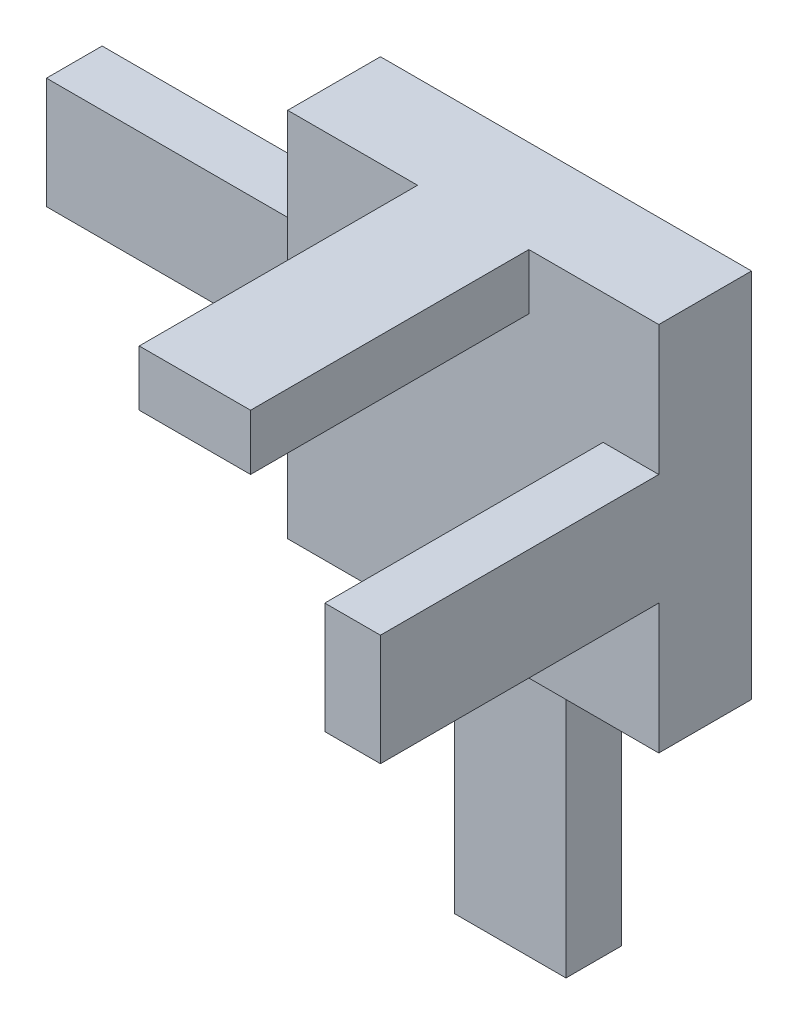
ISO-10303-21;
HEADER;
FILE_DESCRIPTION(('STEP AP214'),'2;1');
FILE_NAME('part.step','',(''),(''),'','','');
FILE_SCHEMA(('AUTOMOTIVE_DESIGN { 1 0 10303 214 1 1 1 1 }'));
ENDSEC;
DATA;
#1=APPLICATION_CONTEXT('core data for automotive mechanical design processes');
#2=APPLICATION_PROTOCOL_DEFINITION('international standard','automotive_design',2000,#1);
#3=PRODUCT_CONTEXT('',#1,'mechanical');
#4=PRODUCT('Part','Part','',(#3));
#5=PRODUCT_RELATED_PRODUCT_CATEGORY('part','',(#4));
#6=PRODUCT_DEFINITION_FORMATION('','',#4);
#7=PRODUCT_DEFINITION_CONTEXT('part definition',#1,'design');
#8=PRODUCT_DEFINITION('design','',#6,#7);
#9=PRODUCT_DEFINITION_SHAPE('','',#8);
#10=(LENGTH_UNIT() NAMED_UNIT(*) SI_UNIT(.MILLI.,.METRE.));
#11=(NAMED_UNIT(*) PLANE_ANGLE_UNIT() SI_UNIT($,.RADIAN.));
#12=(NAMED_UNIT(*) SI_UNIT($,.STERADIAN.) SOLID_ANGLE_UNIT());
#13=UNCERTAINTY_MEASURE_WITH_UNIT(LENGTH_MEASURE(1.E-05),#10,'distance_accuracy_value','');
#14=(GEOMETRIC_REPRESENTATION_CONTEXT(3) GLOBAL_UNCERTAINTY_ASSIGNED_CONTEXT((#13)) GLOBAL_UNIT_ASSIGNED_CONTEXT((#10,
#11,#12)) REPRESENTATION_CONTEXT('',''));
#15=CARTESIAN_POINT('',(0.,0.,0.));
#16=DIRECTION('',(0.,0.,1.));
#17=DIRECTION('',(1.,0.,0.));
#18=AXIS2_PLACEMENT_3D('',#15,#16,#17);
#19=CARTESIAN_POINT('',(0.,0.,5.));
#20=DIRECTION('',(1.,0.,0.));
#21=DIRECTION('',(0.,0.,-1.));
#22=AXIS2_PLACEMENT_3D('',#19,#20,#21);
#23=PLANE('',#22);
#24=DIRECTION('',(0.,0.,-1.));
#25=VECTOR('',#24,1.);
#26=CARTESIAN_POINT('',(0.,13.,0.));
#27=LINE('',#26,#25);
#28=CARTESIAN_POINT('',(0.,13.,3.));
#29=VERTEX_POINT('',#28);
#30=CARTESIAN_POINT('',(0.,13.,0.));
#31=VERTEX_POINT('',#30);
#32=EDGE_CURVE('E47',#29,#31,#27,.T.);
#33=ORIENTED_EDGE('',*,*,#32,.F.);
#34=DIRECTION('',(0.,1.,0.));
#35=VECTOR('',#34,1.);
#36=CARTESIAN_POINT('',(0.,13.,3.));
#37=LINE('',#36,#35);
#38=CARTESIAN_POINT('',(0.,7.,3.));
#39=VERTEX_POINT('',#38);
#40=EDGE_CURVE('E537',#39,#29,#37,.T.);
#41=ORIENTED_EDGE('',*,*,#40,.F.);
#42=DIRECTION('',(0.,0.,1.));
#43=VECTOR('',#42,1.);
#44=CARTESIAN_POINT('',(0.,7.,0.));
#45=LINE('',#44,#43);
#46=CARTESIAN_POINT('',(0.,7.,0.));
#47=VERTEX_POINT('',#46);
#48=EDGE_CURVE('E53',#47,#39,#45,.T.);
#49=ORIENTED_EDGE('',*,*,#48,.F.);
#50=DIRECTION('',(0.,-1.,0.));
#51=VECTOR('',#50,1.);
#52=CARTESIAN_POINT('',(0.,0.,0.));
#53=LINE('',#52,#51);
#54=CARTESIAN_POINT('',(0.,0.,0.));
#55=VERTEX_POINT('',#54);
#56=EDGE_CURVE('E191',#47,#55,#53,.T.);
#57=ORIENTED_EDGE('',*,*,#56,.T.);
#58=DIRECTION('',(0.,0.,-1.));
#59=VECTOR('',#58,1.);
#60=CARTESIAN_POINT('',(0.,0.,5.));
#61=LINE('',#60,#59);
#62=CARTESIAN_POINT('',(0.,0.,5.));
#63=VERTEX_POINT('',#62);
#64=EDGE_CURVE('E11',#63,#55,#61,.T.);
#65=ORIENTED_EDGE('',*,*,#64,.F.);
#66=DIRECTION('',(0.,-1.,0.));
#67=VECTOR('',#66,1.);
#68=CARTESIAN_POINT('',(0.,0.,5.));
#69=LINE('',#68,#67);
#70=CARTESIAN_POINT('',(0.,20.,5.));
#71=VERTEX_POINT('',#70);
#72=EDGE_CURVE('E287',#71,#63,#69,.T.);
#73=ORIENTED_EDGE('',*,*,#72,.F.);
#74=DIRECTION('',(0.,0.,-1.));
#75=VECTOR('',#74,1.);
#76=CARTESIAN_POINT('',(0.,20.,5.));
#77=LINE('',#76,#75);
#78=CARTESIAN_POINT('',(0.,20.,0.));
#79=VERTEX_POINT('',#78);
#80=EDGE_CURVE('E299',#71,#79,#77,.T.);
#81=ORIENTED_EDGE('',*,*,#80,.T.);
#82=EDGE_CURVE('E300',#79,#31,#53,.T.);
#83=ORIENTED_EDGE('',*,*,#82,.T.);
#84=EDGE_LOOP('',(#33,#41,#49,#57,#65,#73,#81,#83));
#85=FACE_BOUND('',#84,.T.);
#86=ADVANCED_FACE('F33',(#85),#23,.F.);
#87=CARTESIAN_POINT('',(0.,0.,5.));
#88=DIRECTION('',(0.,1.,0.));
#89=DIRECTION('',(0.,0.,1.));
#90=AXIS2_PLACEMENT_3D('',#87,#88,#89);
#91=PLANE('',#90);
#92=DIRECTION('',(0.,0.,-1.));
#93=VECTOR('',#92,1.);
#94=CARTESIAN_POINT('',(7.,0.,0.));
#95=LINE('',#94,#93);
#96=CARTESIAN_POINT('',(7.,0.,3.));
#97=VERTEX_POINT('',#96);
#98=CARTESIAN_POINT('',(7.,0.,0.));
#99=VERTEX_POINT('',#98);
#100=EDGE_CURVE('E192',#97,#99,#95,.T.);
#101=ORIENTED_EDGE('',*,*,#100,.F.);
#102=DIRECTION('',(-1.,0.,0.));
#103=VECTOR('',#102,1.);
#104=CARTESIAN_POINT('',(7.,0.,3.));
#105=LINE('',#104,#103);
#106=CARTESIAN_POINT('',(13.,0.,3.));
#107=VERTEX_POINT('',#106);
#108=EDGE_CURVE('E205',#107,#97,#105,.T.);
#109=ORIENTED_EDGE('',*,*,#108,.F.);
#110=DIRECTION('',(0.,0.,1.));
#111=VECTOR('',#110,1.);
#112=CARTESIAN_POINT('',(13.,0.,0.));
#113=LINE('',#112,#111);
#114=CARTESIAN_POINT('',(13.,0.,0.));
#115=VERTEX_POINT('',#114);
#116=EDGE_CURVE('E195',#115,#107,#113,.T.);
#117=ORIENTED_EDGE('',*,*,#116,.F.);
#118=DIRECTION('',(1.,0.,0.));
#119=VECTOR('',#118,1.);
#120=CARTESIAN_POINT('',(0.,0.,0.));
#121=LINE('',#120,#119);
#122=CARTESIAN_POINT('',(20.,0.,0.));
#123=VERTEX_POINT('',#122);
#124=EDGE_CURVE('E302',#115,#123,#121,.T.);
#125=ORIENTED_EDGE('',*,*,#124,.T.);
#126=DIRECTION('',(0.,0.,-1.));
#127=VECTOR('',#126,1.);
#128=CARTESIAN_POINT('',(20.,0.,5.));
#129=LINE('',#128,#127);
#130=CARTESIAN_POINT('',(20.,0.,5.));
#131=VERTEX_POINT('',#130);
#132=EDGE_CURVE('E40',#131,#123,#129,.T.);
#133=ORIENTED_EDGE('',*,*,#132,.F.);
#134=DIRECTION('',(1.,0.,0.));
#135=VECTOR('',#134,1.);
#136=CARTESIAN_POINT('',(0.,0.,5.));
#137=LINE('',#136,#135);
#138=EDGE_CURVE('E290',#63,#131,#137,.T.);
#139=ORIENTED_EDGE('',*,*,#138,.F.);
#140=ORIENTED_EDGE('',*,*,#64,.T.);
#141=EDGE_CURVE('E303',#55,#99,#121,.T.);
#142=ORIENTED_EDGE('',*,*,#141,.T.);
#143=EDGE_LOOP('',(#101,#109,#117,#125,#133,#139,#140,#142));
#144=FACE_BOUND('',#143,.T.);
#145=ADVANCED_FACE('F357',(#144),#91,.F.);
#146=CARTESIAN_POINT('',(0.,0.,5.));
#147=DIRECTION('',(0.,0.,-1.));
#148=DIRECTION('',(-1.,0.,0.));
#149=AXIS2_PLACEMENT_3D('',#146,#147,#148);
#150=PLANE('',#149);
#151=DIRECTION('',(-1.,0.,0.));
#152=VECTOR('',#151,1.);
#153=CARTESIAN_POINT('',(20.,13.,5.));
#154=LINE('',#153,#152);
#155=CARTESIAN_POINT('',(20.,13.,5.));
#156=VERTEX_POINT('',#155);
#157=CARTESIAN_POINT('',(17.,13.,5.));
#158=VERTEX_POINT('',#157);
#159=EDGE_CURVE('E227',#156,#158,#154,.T.);
#160=ORIENTED_EDGE('',*,*,#159,.F.);
#161=DIRECTION('',(0.,1.,0.));
#162=VECTOR('',#161,1.);
#163=CARTESIAN_POINT('',(20.,0.,5.));
#164=LINE('',#163,#162);
#165=CARTESIAN_POINT('',(20.,20.,5.));
#166=VERTEX_POINT('',#165);
#167=EDGE_CURVE('E293',#156,#166,#164,.T.);
#168=ORIENTED_EDGE('',*,*,#167,.T.);
#169=DIRECTION('',(-1.,0.,0.));
#170=VECTOR('',#169,1.);
#171=CARTESIAN_POINT('',(0.,20.,5.));
#172=LINE('',#171,#170);
#173=CARTESIAN_POINT('',(13.,20.,5.));
#174=VERTEX_POINT('',#173);
#175=EDGE_CURVE('E297',#166,#174,#172,.T.);
#176=ORIENTED_EDGE('',*,*,#175,.T.);
#177=DIRECTION('',(0.,1.,0.));
#178=VECTOR('',#177,1.);
#179=CARTESIAN_POINT('',(13.,20.,5.));
#180=LINE('',#179,#178);
#181=CARTESIAN_POINT('',(13.,17.,5.));
#182=VERTEX_POINT('',#181);
#183=EDGE_CURVE('E262',#182,#174,#180,.T.);
#184=ORIENTED_EDGE('',*,*,#183,.F.);
#185=DIRECTION('',(1.,0.,0.));
#186=VECTOR('',#185,1.);
#187=CARTESIAN_POINT('',(7.,17.,5.));
#188=LINE('',#187,#186);
#189=CARTESIAN_POINT('',(7.,17.,5.));
#190=VERTEX_POINT('',#189);
#191=EDGE_CURVE('E271',#190,#182,#188,.T.);
#192=ORIENTED_EDGE('',*,*,#191,.F.);
#193=DIRECTION('',(0.,-1.,0.));
#194=VECTOR('',#193,1.);
#195=CARTESIAN_POINT('',(7.,20.,5.));
#196=LINE('',#195,#194);
#197=CARTESIAN_POINT('',(7.,20.,5.));
#198=VERTEX_POINT('',#197);
#199=EDGE_CURVE('E257',#198,#190,#196,.T.);
#200=ORIENTED_EDGE('',*,*,#199,.F.);
#201=EDGE_CURVE('E296',#198,#71,#172,.T.);
#202=ORIENTED_EDGE('',*,*,#201,.T.);
#203=ORIENTED_EDGE('',*,*,#72,.T.);
#204=ORIENTED_EDGE('',*,*,#138,.T.);
#205=CARTESIAN_POINT('',(20.,7.,5.));
#206=VERTEX_POINT('',#205);
#207=EDGE_CURVE('E294',#131,#206,#164,.T.);
#208=ORIENTED_EDGE('',*,*,#207,.T.);
#209=DIRECTION('',(1.,0.,0.));
#210=VECTOR('',#209,1.);
#211=CARTESIAN_POINT('',(20.,7.,5.));
#212=LINE('',#211,#210);
#213=CARTESIAN_POINT('',(17.,7.,5.));
#214=VERTEX_POINT('',#213);
#215=EDGE_CURVE('E232',#214,#206,#212,.T.);
#216=ORIENTED_EDGE('',*,*,#215,.F.);
#217=DIRECTION('',(0.,-1.,0.));
#218=VECTOR('',#217,1.);
#219=CARTESIAN_POINT('',(17.,13.,5.));
#220=LINE('',#219,#218);
#221=EDGE_CURVE('E241',#158,#214,#220,.T.);
#222=ORIENTED_EDGE('',*,*,#221,.F.);
#223=EDGE_LOOP('',(#160,#168,#176,#184,#192,#200,#202,#203,#204,#208,#216,#222));
#224=FACE_BOUND('',#223,.T.);
#225=ADVANCED_FACE('F332',(#224),#150,.F.);
#226=CARTESIAN_POINT('',(20.,0.,5.));
#227=DIRECTION('',(-1.,0.,0.));
#228=DIRECTION('',(0.,0.,1.));
#229=AXIS2_PLACEMENT_3D('',#226,#227,#228);
#230=PLANE('',#229);
#231=DIRECTION('',(0.,1.,0.));
#232=VECTOR('',#231,1.);
#233=CARTESIAN_POINT('',(20.,0.,0.));
#234=LINE('',#233,#232);
#235=CARTESIAN_POINT('',(20.,20.,0.));
#236=VERTEX_POINT('',#235);
#237=EDGE_CURVE('E305',#123,#236,#234,.T.);
#238=ORIENTED_EDGE('',*,*,#237,.T.);
#239=DIRECTION('',(0.,0.,-1.));
#240=VECTOR('',#239,1.);
#241=CARTESIAN_POINT('',(20.,20.,5.));
#242=LINE('',#241,#240);
#243=EDGE_CURVE('E310',#166,#236,#242,.T.);
#244=ORIENTED_EDGE('',*,*,#243,.F.);
#245=ORIENTED_EDGE('',*,*,#167,.F.);
#246=DIRECTION('',(0.,0.,-1.));
#247=VECTOR('',#246,1.);
#248=CARTESIAN_POINT('',(20.,13.,20.));
#249=LINE('',#248,#247);
#250=CARTESIAN_POINT('',(20.,13.,20.));
#251=VERTEX_POINT('',#250);
#252=EDGE_CURVE('E254',#251,#156,#249,.T.);
#253=ORIENTED_EDGE('',*,*,#252,.F.);
#254=DIRECTION('',(0.,1.,0.));
#255=VECTOR('',#254,1.);
#256=CARTESIAN_POINT('',(20.,13.,20.));
#257=LINE('',#256,#255);
#258=CARTESIAN_POINT('',(20.,7.,20.));
#259=VERTEX_POINT('',#258);
#260=EDGE_CURVE('E228',#259,#251,#257,.T.);
#261=ORIENTED_EDGE('',*,*,#260,.F.);
#262=DIRECTION('',(0.,0.,-1.));
#263=VECTOR('',#262,1.);
#264=CARTESIAN_POINT('',(20.,7.,20.));
#265=LINE('',#264,#263);
#266=EDGE_CURVE('E238',#259,#206,#265,.T.);
#267=ORIENTED_EDGE('',*,*,#266,.T.);
#268=ORIENTED_EDGE('',*,*,#207,.F.);
#269=ORIENTED_EDGE('',*,*,#132,.T.);
#270=EDGE_LOOP('',(#238,#244,#245,#253,#261,#267,#268,#269));
#271=FACE_BOUND('',#270,.T.);
#272=ADVANCED_FACE('F317',(#271),#230,.F.);
#273=CARTESIAN_POINT('',(0.,20.,5.));
#274=DIRECTION('',(0.,-1.,0.));
#275=DIRECTION('',(0.,0.,-1.));
#276=AXIS2_PLACEMENT_3D('',#273,#274,#275);
#277=PLANE('',#276);
#278=DIRECTION('',(-1.,0.,0.));
#279=VECTOR('',#278,1.);
#280=CARTESIAN_POINT('',(0.,20.,0.));
#281=LINE('',#280,#279);
#282=EDGE_CURVE('E291',#236,#79,#281,.T.);
#283=ORIENTED_EDGE('',*,*,#282,.T.);
#284=ORIENTED_EDGE('',*,*,#80,.F.);
#285=ORIENTED_EDGE('',*,*,#201,.F.);
#286=DIRECTION('',(0.,0.,-1.));
#287=VECTOR('',#286,1.);
#288=CARTESIAN_POINT('',(7.,20.,20.));
#289=LINE('',#288,#287);
#290=CARTESIAN_POINT('',(7.,20.,20.));
#291=VERTEX_POINT('',#290);
#292=EDGE_CURVE('E268',#291,#198,#289,.T.);
#293=ORIENTED_EDGE('',*,*,#292,.F.);
#294=DIRECTION('',(-1.,0.,0.));
#295=VECTOR('',#294,1.);
#296=CARTESIAN_POINT('',(7.,20.,20.));
#297=LINE('',#296,#295);
#298=CARTESIAN_POINT('',(13.,20.,20.));
#299=VERTEX_POINT('',#298);
#300=EDGE_CURVE('E266',#299,#291,#297,.T.);
#301=ORIENTED_EDGE('',*,*,#300,.F.);
#302=DIRECTION('',(0.,0.,-1.));
#303=VECTOR('',#302,1.);
#304=CARTESIAN_POINT('',(13.,20.,20.));
#305=LINE('',#304,#303);
#306=EDGE_CURVE('E278',#299,#174,#305,.T.);
#307=ORIENTED_EDGE('',*,*,#306,.T.);
#308=ORIENTED_EDGE('',*,*,#175,.F.);
#309=ORIENTED_EDGE('',*,*,#243,.T.);
#310=EDGE_LOOP('',(#283,#284,#285,#293,#301,#307,#308,#309));
#311=FACE_BOUND('',#310,.T.);
#312=ADVANCED_FACE('F325',(#311),#277,.F.);
#313=CARTESIAN_POINT('',(0.,0.,0.));
#314=DIRECTION('',(0.,0.,-1.));
#315=DIRECTION('',(-1.,0.,0.));
#316=AXIS2_PLACEMENT_3D('',#313,#314,#315);
#317=PLANE('',#316);
#318=ORIENTED_EDGE('',*,*,#82,.F.);
#319=ORIENTED_EDGE('',*,*,#282,.F.);
#320=ORIENTED_EDGE('',*,*,#237,.F.);
#321=ORIENTED_EDGE('',*,*,#124,.F.);
#322=DIRECTION('',(0.,1.,0.));
#323=VECTOR('',#322,1.);
#324=CARTESIAN_POINT('',(13.,-15.,0.));
#325=LINE('',#324,#323);
#326=CARTESIAN_POINT('',(13.,-15.,0.));
#327=VERTEX_POINT('',#326);
#328=EDGE_CURVE('E221',#327,#115,#325,.T.);
#329=ORIENTED_EDGE('',*,*,#328,.F.);
#330=DIRECTION('',(1.,0.,0.));
#331=VECTOR('',#330,1.);
#332=CARTESIAN_POINT('',(7.,-15.,0.));
#333=LINE('',#332,#331);
#334=CARTESIAN_POINT('',(7.,-15.,0.));
#335=VERTEX_POINT('',#334);
#336=EDGE_CURVE('E204',#335,#327,#333,.T.);
#337=ORIENTED_EDGE('',*,*,#336,.F.);
#338=DIRECTION('',(0.,1.,0.));
#339=VECTOR('',#338,1.);
#340=CARTESIAN_POINT('',(7.,-15.,0.));
#341=LINE('',#340,#339);
#342=EDGE_CURVE('E224',#335,#99,#341,.T.);
#343=ORIENTED_EDGE('',*,*,#342,.T.);
#344=ORIENTED_EDGE('',*,*,#141,.F.);
#345=ORIENTED_EDGE('',*,*,#56,.F.);
#346=DIRECTION('',(1.,0.,0.));
#347=VECTOR('',#346,1.);
#348=CARTESIAN_POINT('',(-15.,7.,0.));
#349=LINE('',#348,#347);
#350=CARTESIAN_POINT('',(-15.,7.,0.));
#351=VERTEX_POINT('',#350);
#352=EDGE_CURVE('E172',#351,#47,#349,.T.);
#353=ORIENTED_EDGE('',*,*,#352,.F.);
#354=DIRECTION('',(0.,-1.,0.));
#355=VECTOR('',#354,1.);
#356=CARTESIAN_POINT('',(-15.,13.,0.));
#357=LINE('',#356,#355);
#358=CARTESIAN_POINT('',(-15.,13.,0.));
#359=VERTEX_POINT('',#358);
#360=EDGE_CURVE('E178',#359,#351,#357,.T.);
#361=ORIENTED_EDGE('',*,*,#360,.F.);
#362=DIRECTION('',(1.,0.,0.));
#363=VECTOR('',#362,1.);
#364=CARTESIAN_POINT('',(-15.,13.,0.));
#365=LINE('',#364,#363);
#366=EDGE_CURVE('E535',#359,#31,#365,.T.);
#367=ORIENTED_EDGE('',*,*,#366,.T.);
#368=EDGE_LOOP('',(#318,#319,#320,#321,#329,#337,#343,#344,#345,#353,#361,#367));
#369=FACE_BOUND('',#368,.T.);
#370=ADVANCED_FACE('F189',(#369),#317,.T.);
#371=CARTESIAN_POINT('',(7.,20.,20.));
#372=DIRECTION('',(1.,0.,0.));
#373=DIRECTION('',(0.,1.,0.));
#374=AXIS2_PLACEMENT_3D('',#371,#372,#373);
#375=PLANE('',#374);
#376=ORIENTED_EDGE('',*,*,#199,.T.);
#377=DIRECTION('',(0.,0.,-1.));
#378=VECTOR('',#377,1.);
#379=CARTESIAN_POINT('',(7.,17.,20.));
#380=LINE('',#379,#378);
#381=CARTESIAN_POINT('',(7.,17.,20.));
#382=VERTEX_POINT('',#381);
#383=EDGE_CURVE('E284',#382,#190,#380,.T.);
#384=ORIENTED_EDGE('',*,*,#383,.F.);
#385=DIRECTION('',(0.,-1.,0.));
#386=VECTOR('',#385,1.);
#387=CARTESIAN_POINT('',(7.,20.,20.));
#388=LINE('',#387,#386);
#389=EDGE_CURVE('E258',#291,#382,#388,.T.);
#390=ORIENTED_EDGE('',*,*,#389,.F.);
#391=ORIENTED_EDGE('',*,*,#292,.T.);
#392=EDGE_LOOP('',(#376,#384,#390,#391));
#393=FACE_BOUND('',#392,.T.);
#394=ADVANCED_FACE('F337',(#393),#375,.F.);
#395=CARTESIAN_POINT('',(7.,17.,20.));
#396=DIRECTION('',(0.,1.,0.));
#397=DIRECTION('',(0.,0.,1.));
#398=AXIS2_PLACEMENT_3D('',#395,#396,#397);
#399=PLANE('',#398);
#400=ORIENTED_EDGE('',*,*,#191,.T.);
#401=DIRECTION('',(0.,0.,-1.));
#402=VECTOR('',#401,1.);
#403=CARTESIAN_POINT('',(13.,17.,20.));
#404=LINE('',#403,#402);
#405=CARTESIAN_POINT('',(13.,17.,20.));
#406=VERTEX_POINT('',#405);
#407=EDGE_CURVE('E281',#406,#182,#404,.T.);
#408=ORIENTED_EDGE('',*,*,#407,.F.);
#409=DIRECTION('',(1.,0.,0.));
#410=VECTOR('',#409,1.);
#411=CARTESIAN_POINT('',(7.,17.,20.));
#412=LINE('',#411,#410);
#413=EDGE_CURVE('E261',#382,#406,#412,.T.);
#414=ORIENTED_EDGE('',*,*,#413,.F.);
#415=ORIENTED_EDGE('',*,*,#383,.T.);
#416=EDGE_LOOP('',(#400,#408,#414,#415));
#417=FACE_BOUND('',#416,.T.);
#418=ADVANCED_FACE('F347',(#417),#399,.F.);
#419=CARTESIAN_POINT('',(13.,20.,20.));
#420=DIRECTION('',(-1.,0.,0.));
#421=DIRECTION('',(0.,0.,1.));
#422=AXIS2_PLACEMENT_3D('',#419,#420,#421);
#423=PLANE('',#422);
#424=ORIENTED_EDGE('',*,*,#183,.T.);
#425=ORIENTED_EDGE('',*,*,#306,.F.);
#426=DIRECTION('',(0.,1.,0.));
#427=VECTOR('',#426,1.);
#428=CARTESIAN_POINT('',(13.,20.,20.));
#429=LINE('',#428,#427);
#430=EDGE_CURVE('E264',#406,#299,#429,.T.);
#431=ORIENTED_EDGE('',*,*,#430,.F.);
#432=ORIENTED_EDGE('',*,*,#407,.T.);
#433=EDGE_LOOP('',(#424,#425,#431,#432));
#434=FACE_BOUND('',#433,.T.);
#435=ADVANCED_FACE('F345',(#434),#423,.F.);
#436=CARTESIAN_POINT('',(0.,0.,20.));
#437=DIRECTION('',(0.,0.,1.));
#438=DIRECTION('',(1.,0.,0.));
#439=AXIS2_PLACEMENT_3D('',#436,#437,#438);
#440=PLANE('',#439);
#441=ORIENTED_EDGE('',*,*,#389,.T.);
#442=ORIENTED_EDGE('',*,*,#413,.T.);
#443=ORIENTED_EDGE('',*,*,#430,.T.);
#444=ORIENTED_EDGE('',*,*,#300,.T.);
#445=EDGE_LOOP('',(#441,#442,#443,#444));
#446=FACE_BOUND('',#445,.T.);
#447=ADVANCED_FACE('F340',(#446),#440,.T.);
#448=CARTESIAN_POINT('',(20.,13.,20.));
#449=DIRECTION('',(0.,-1.,0.));
#450=DIRECTION('',(1.,0.,0.));
#451=AXIS2_PLACEMENT_3D('',#448,#449,#450);
#452=PLANE('',#451);
#453=ORIENTED_EDGE('',*,*,#159,.T.);
#454=DIRECTION('',(0.,0.,-1.));
#455=VECTOR('',#454,1.);
#456=CARTESIAN_POINT('',(17.,13.,20.));
#457=LINE('',#456,#455);
#458=CARTESIAN_POINT('',(17.,13.,20.));
#459=VERTEX_POINT('',#458);
#460=EDGE_CURVE('E251',#459,#158,#457,.T.);
#461=ORIENTED_EDGE('',*,*,#460,.F.);
#462=DIRECTION('',(-1.,0.,0.));
#463=VECTOR('',#462,1.);
#464=CARTESIAN_POINT('',(20.,13.,20.));
#465=LINE('',#464,#463);
#466=EDGE_CURVE('E231',#251,#459,#465,.T.);
#467=ORIENTED_EDGE('',*,*,#466,.F.);
#468=ORIENTED_EDGE('',*,*,#252,.T.);
#469=EDGE_LOOP('',(#453,#461,#467,#468));
#470=FACE_BOUND('',#469,.T.);
#471=ADVANCED_FACE('F402',(#470),#452,.F.);
#472=CARTESIAN_POINT('',(17.,13.,20.));
#473=DIRECTION('',(1.,0.,0.));
#474=DIRECTION('',(0.,0.,-1.));
#475=AXIS2_PLACEMENT_3D('',#472,#473,#474);
#476=PLANE('',#475);
#477=ORIENTED_EDGE('',*,*,#221,.T.);
#478=DIRECTION('',(0.,0.,-1.));
#479=VECTOR('',#478,1.);
#480=CARTESIAN_POINT('',(17.,7.,20.));
#481=LINE('',#480,#479);
#482=CARTESIAN_POINT('',(17.,7.,20.));
#483=VERTEX_POINT('',#482);
#484=EDGE_CURVE('E248',#483,#214,#481,.T.);
#485=ORIENTED_EDGE('',*,*,#484,.F.);
#486=DIRECTION('',(0.,-1.,0.));
#487=VECTOR('',#486,1.);
#488=CARTESIAN_POINT('',(17.,13.,20.));
#489=LINE('',#488,#487);
#490=EDGE_CURVE('E234',#459,#483,#489,.T.);
#491=ORIENTED_EDGE('',*,*,#490,.F.);
#492=ORIENTED_EDGE('',*,*,#460,.T.);
#493=EDGE_LOOP('',(#477,#485,#491,#492));
#494=FACE_BOUND('',#493,.T.);
#495=ADVANCED_FACE('F411',(#494),#476,.F.);
#496=CARTESIAN_POINT('',(20.,7.,20.));
#497=DIRECTION('',(0.,1.,0.));
#498=DIRECTION('',(-1.,0.,0.));
#499=AXIS2_PLACEMENT_3D('',#496,#497,#498);
#500=PLANE('',#499);
#501=ORIENTED_EDGE('',*,*,#215,.T.);
#502=ORIENTED_EDGE('',*,*,#266,.F.);
#503=DIRECTION('',(1.,0.,0.));
#504=VECTOR('',#503,1.);
#505=CARTESIAN_POINT('',(20.,7.,20.));
#506=LINE('',#505,#504);
#507=EDGE_CURVE('E236',#483,#259,#506,.T.);
#508=ORIENTED_EDGE('',*,*,#507,.F.);
#509=ORIENTED_EDGE('',*,*,#484,.T.);
#510=EDGE_LOOP('',(#501,#502,#508,#509));
#511=FACE_BOUND('',#510,.T.);
#512=ADVANCED_FACE('F421',(#511),#500,.F.);
#513=CARTESIAN_POINT('',(0.,0.,20.));
#514=DIRECTION('',(0.,0.,-1.));
#515=DIRECTION('',(-1.,0.,0.));
#516=AXIS2_PLACEMENT_3D('',#513,#514,#515);
#517=PLANE('',#516);
#518=ORIENTED_EDGE('',*,*,#260,.T.);
#519=ORIENTED_EDGE('',*,*,#466,.T.);
#520=ORIENTED_EDGE('',*,*,#490,.T.);
#521=ORIENTED_EDGE('',*,*,#507,.T.);
#522=EDGE_LOOP('',(#518,#519,#520,#521));
#523=FACE_BOUND('',#522,.T.);
#524=ADVANCED_FACE('F431',(#523),#517,.F.);
#525=CARTESIAN_POINT('',(7.,-15.,0.));
#526=DIRECTION('',(1.,0.,0.));
#527=DIRECTION('',(0.,0.,-1.));
#528=AXIS2_PLACEMENT_3D('',#525,#526,#527);
#529=PLANE('',#528);
#530=ORIENTED_EDGE('',*,*,#100,.T.);
#531=ORIENTED_EDGE('',*,*,#342,.F.);
#532=DIRECTION('',(0.,0.,-1.));
#533=VECTOR('',#532,1.);
#534=CARTESIAN_POINT('',(7.,-15.,0.));
#535=LINE('',#534,#533);
#536=CARTESIAN_POINT('',(7.,-15.,3.));
#537=VERTEX_POINT('',#536);
#538=EDGE_CURVE('E201',#537,#335,#535,.T.);
#539=ORIENTED_EDGE('',*,*,#538,.F.);
#540=DIRECTION('',(0.,1.,0.));
#541=VECTOR('',#540,1.);
#542=CARTESIAN_POINT('',(7.,-15.,3.));
#543=LINE('',#542,#541);
#544=EDGE_CURVE('E210',#537,#97,#543,.T.);
#545=ORIENTED_EDGE('',*,*,#544,.T.);
#546=EDGE_LOOP('',(#530,#531,#539,#545));
#547=FACE_BOUND('',#546,.T.);
#548=ADVANCED_FACE('F440',(#547),#529,.F.);
#549=CARTESIAN_POINT('',(13.,-15.,0.));
#550=DIRECTION('',(-1.,0.,0.));
#551=DIRECTION('',(0.,0.,1.));
#552=AXIS2_PLACEMENT_3D('',#549,#550,#551);
#553=PLANE('',#552);
#554=ORIENTED_EDGE('',*,*,#116,.T.);
#555=DIRECTION('',(0.,1.,0.));
#556=VECTOR('',#555,1.);
#557=CARTESIAN_POINT('',(13.,-15.,3.));
#558=LINE('',#557,#556);
#559=CARTESIAN_POINT('',(13.,-15.,3.));
#560=VERTEX_POINT('',#559);
#561=EDGE_CURVE('E218',#560,#107,#558,.T.);
#562=ORIENTED_EDGE('',*,*,#561,.F.);
#563=DIRECTION('',(0.,0.,1.));
#564=VECTOR('',#563,1.);
#565=CARTESIAN_POINT('',(13.,-15.,0.));
#566=LINE('',#565,#564);
#567=EDGE_CURVE('E207',#327,#560,#566,.T.);
#568=ORIENTED_EDGE('',*,*,#567,.F.);
#569=ORIENTED_EDGE('',*,*,#328,.T.);
#570=EDGE_LOOP('',(#554,#562,#568,#569));
#571=FACE_BOUND('',#570,.T.);
#572=ADVANCED_FACE('F456',(#571),#553,.F.);
#573=CARTESIAN_POINT('',(7.,-15.,3.));
#574=DIRECTION('',(0.,0.,-1.));
#575=DIRECTION('',(-1.,0.,0.));
#576=AXIS2_PLACEMENT_3D('',#573,#574,#575);
#577=PLANE('',#576);
#578=ORIENTED_EDGE('',*,*,#108,.T.);
#579=ORIENTED_EDGE('',*,*,#544,.F.);
#580=DIRECTION('',(-1.,0.,0.));
#581=VECTOR('',#580,1.);
#582=CARTESIAN_POINT('',(7.,-15.,3.));
#583=LINE('',#582,#581);
#584=EDGE_CURVE('E209',#560,#537,#583,.T.);
#585=ORIENTED_EDGE('',*,*,#584,.F.);
#586=ORIENTED_EDGE('',*,*,#561,.T.);
#587=EDGE_LOOP('',(#578,#579,#585,#586));
#588=FACE_BOUND('',#587,.T.);
#589=ADVANCED_FACE('F466',(#588),#577,.F.);
#590=CARTESIAN_POINT('',(0.,-15.,0.));
#591=DIRECTION('',(0.,1.,0.));
#592=DIRECTION('',(0.,0.,1.));
#593=AXIS2_PLACEMENT_3D('',#590,#591,#592);
#594=PLANE('',#593);
#595=ORIENTED_EDGE('',*,*,#538,.T.);
#596=ORIENTED_EDGE('',*,*,#336,.T.);
#597=ORIENTED_EDGE('',*,*,#567,.T.);
#598=ORIENTED_EDGE('',*,*,#584,.T.);
#599=EDGE_LOOP('',(#595,#596,#597,#598));
#600=FACE_BOUND('',#599,.T.);
#601=ADVANCED_FACE('F476',(#600),#594,.F.);
#602=CARTESIAN_POINT('',(-15.,7.,0.));
#603=DIRECTION('',(0.,1.,0.));
#604=DIRECTION('',(0.,0.,1.));
#605=AXIS2_PLACEMENT_3D('',#602,#603,#604);
#606=PLANE('',#605);
#607=ORIENTED_EDGE('',*,*,#48,.T.);
#608=DIRECTION('',(1.,0.,0.));
#609=VECTOR('',#608,1.);
#610=CARTESIAN_POINT('',(-15.,7.,3.));
#611=LINE('',#610,#609);
#612=CARTESIAN_POINT('',(-15.,7.,3.));
#613=VERTEX_POINT('',#612);
#614=EDGE_CURVE('E174',#613,#39,#611,.T.);
#615=ORIENTED_EDGE('',*,*,#614,.F.);
#616=DIRECTION('',(0.,0.,1.));
#617=VECTOR('',#616,1.);
#618=CARTESIAN_POINT('',(-15.,7.,0.));
#619=LINE('',#618,#617);
#620=EDGE_CURVE('E168',#351,#613,#619,.T.);
#621=ORIENTED_EDGE('',*,*,#620,.F.);
#622=ORIENTED_EDGE('',*,*,#352,.T.);
#623=EDGE_LOOP('',(#607,#615,#621,#622));
#624=FACE_BOUND('',#623,.T.);
#625=ADVANCED_FACE('F170',(#624),#606,.F.);
#626=CARTESIAN_POINT('',(-15.,13.,3.));
#627=DIRECTION('',(0.,0.,-1.));
#628=DIRECTION('',(0.,1.,0.));
#629=AXIS2_PLACEMENT_3D('',#626,#627,#628);
#630=PLANE('',#629);
#631=ORIENTED_EDGE('',*,*,#40,.T.);
#632=DIRECTION('',(1.,0.,0.));
#633=VECTOR('',#632,1.);
#634=CARTESIAN_POINT('',(-15.,13.,3.));
#635=LINE('',#634,#633);
#636=CARTESIAN_POINT('',(-15.,13.,3.));
#637=VERTEX_POINT('',#636);
#638=EDGE_CURVE('E197',#637,#29,#635,.T.);
#639=ORIENTED_EDGE('',*,*,#638,.F.);
#640=DIRECTION('',(0.,1.,0.));
#641=VECTOR('',#640,1.);
#642=CARTESIAN_POINT('',(-15.,13.,3.));
#643=LINE('',#642,#641);
#644=EDGE_CURVE('E177',#613,#637,#643,.T.);
#645=ORIENTED_EDGE('',*,*,#644,.F.);
#646=ORIENTED_EDGE('',*,*,#614,.T.);
#647=EDGE_LOOP('',(#631,#639,#645,#646));
#648=FACE_BOUND('',#647,.T.);
#649=ADVANCED_FACE('F504',(#648),#630,.F.);
#650=CARTESIAN_POINT('',(-15.,13.,0.));
#651=DIRECTION('',(0.,-1.,0.));
#652=DIRECTION('',(0.,0.,-1.));
#653=AXIS2_PLACEMENT_3D('',#650,#651,#652);
#654=PLANE('',#653);
#655=ORIENTED_EDGE('',*,*,#32,.T.);
#656=ORIENTED_EDGE('',*,*,#366,.F.);
#657=DIRECTION('',(0.,0.,-1.));
#658=VECTOR('',#657,1.);
#659=CARTESIAN_POINT('',(-15.,13.,0.));
#660=LINE('',#659,#658);
#661=EDGE_CURVE('E183',#637,#359,#660,.T.);
#662=ORIENTED_EDGE('',*,*,#661,.F.);
#663=ORIENTED_EDGE('',*,*,#638,.T.);
#664=EDGE_LOOP('',(#655,#656,#662,#663));
#665=FACE_BOUND('',#664,.T.);
#666=ADVANCED_FACE('F512',(#665),#654,.F.);
#667=CARTESIAN_POINT('',(-15.,0.,0.));
#668=DIRECTION('',(-1.,0.,0.));
#669=DIRECTION('',(0.,0.,1.));
#670=AXIS2_PLACEMENT_3D('',#667,#668,#669);
#671=PLANE('',#670);
#672=ORIENTED_EDGE('',*,*,#360,.T.);
#673=ORIENTED_EDGE('',*,*,#620,.T.);
#674=ORIENTED_EDGE('',*,*,#644,.T.);
#675=ORIENTED_EDGE('',*,*,#661,.T.);
#676=EDGE_LOOP('',(#672,#673,#674,#675));
#677=FACE_BOUND('',#676,.T.);
#678=ADVANCED_FACE('F181',(#677),#671,.T.);
#679=CLOSED_SHELL('',(#86,#145,#225,#272,#312,#370,#394,#418,#435,#447,#471,#495,#512,#524,#548,
#572,#589,#601,#625,#649,#666,#678));
#680=MANIFOLD_SOLID_BREP('B2',#679);
#681=ADVANCED_BREP_SHAPE_REPRESENTATION('',(#18,#680),#14);
#682=SHAPE_DEFINITION_REPRESENTATION(#9,#681);
ENDSEC;
END-ISO-10303-21;
